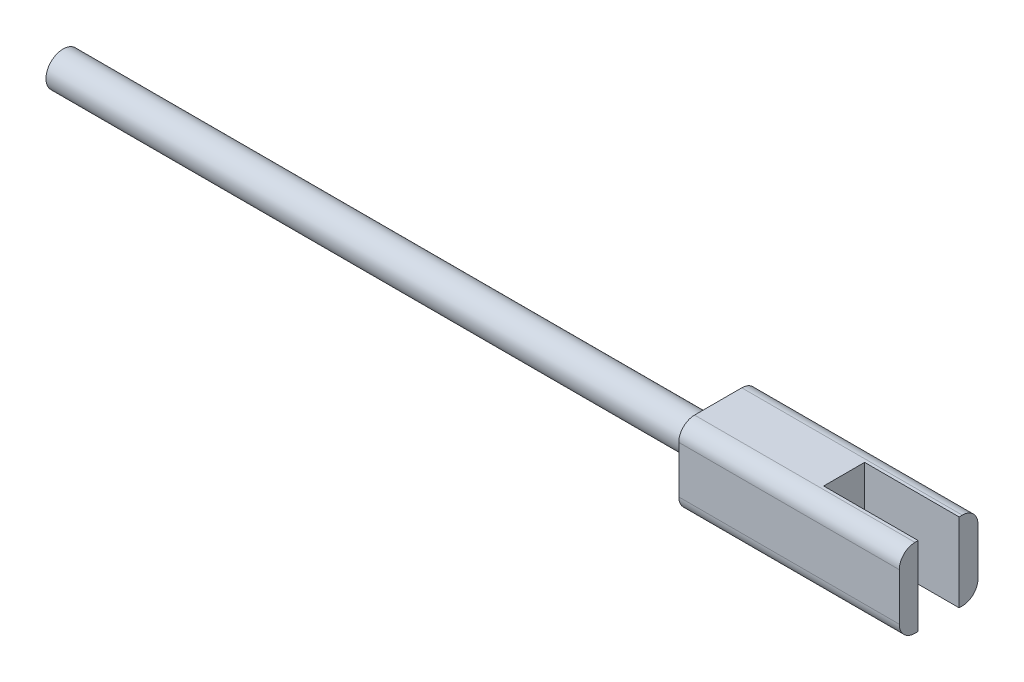
ISO-10303-21;
HEADER;
FILE_DESCRIPTION(('STEP AP214'),'2;1');
FILE_NAME('part.step','',(''),(''),'','','');
FILE_SCHEMA(('AUTOMOTIVE_DESIGN { 1 0 10303 214 1 1 1 1 }'));
ENDSEC;
DATA;
#1=APPLICATION_CONTEXT('core data for automotive mechanical design processes');
#2=APPLICATION_PROTOCOL_DEFINITION('international standard','automotive_design',2000,#1);
#3=PRODUCT_CONTEXT('',#1,'mechanical');
#4=PRODUCT('Part','Part','',(#3));
#5=PRODUCT_RELATED_PRODUCT_CATEGORY('part','',(#4));
#6=PRODUCT_DEFINITION_FORMATION('','',#4);
#7=PRODUCT_DEFINITION_CONTEXT('part definition',#1,'design');
#8=PRODUCT_DEFINITION('design','',#6,#7);
#9=PRODUCT_DEFINITION_SHAPE('','',#8);
#10=(LENGTH_UNIT() NAMED_UNIT(*) SI_UNIT(.MILLI.,.METRE.));
#11=(NAMED_UNIT(*) PLANE_ANGLE_UNIT() SI_UNIT($,.RADIAN.));
#12=(NAMED_UNIT(*) SI_UNIT($,.STERADIAN.) SOLID_ANGLE_UNIT());
#13=UNCERTAINTY_MEASURE_WITH_UNIT(LENGTH_MEASURE(1.E-05),#10,'distance_accuracy_value','');
#14=(GEOMETRIC_REPRESENTATION_CONTEXT(3) GLOBAL_UNCERTAINTY_ASSIGNED_CONTEXT((#13)) GLOBAL_UNIT_ASSIGNED_CONTEXT((#10,
#11,#12)) REPRESENTATION_CONTEXT('',''));
#15=CARTESIAN_POINT('',(0.,0.,0.));
#16=DIRECTION('',(0.,0.,1.));
#17=DIRECTION('',(1.,0.,0.));
#18=AXIS2_PLACEMENT_3D('',#15,#16,#17);
#19=CARTESIAN_POINT('',(55.594,-1.5,1.5));
#20=DIRECTION('',(1.,0.,0.));
#21=DIRECTION('',(0.,0.,-1.));
#22=AXIS2_PLACEMENT_3D('',#19,#20,#21);
#23=PLANE('',#22);
#24=DIRECTION('',(0.,1.,0.));
#25=VECTOR('',#24,1.);
#26=CARTESIAN_POINT('',(55.594,-1.5,-1.3));
#27=LINE('',#26,#25);
#28=CARTESIAN_POINT('',(55.594,-2.5,-1.3));
#29=VERTEX_POINT('',#28);
#30=CARTESIAN_POINT('',(55.594,2.5,-1.3));
#31=VERTEX_POINT('',#30);
#32=EDGE_CURVE('E11',#29,#31,#27,.T.);
#33=ORIENTED_EDGE('',*,*,#32,.F.);
#34=DIRECTION('',(0.,0.,-1.));
#35=VECTOR('',#34,1.);
#36=CARTESIAN_POINT('',(55.594,-2.5,1.5));
#37=LINE('',#36,#35);
#38=CARTESIAN_POINT('',(55.594,-2.5,-1.5));
#39=VERTEX_POINT('',#38);
#40=EDGE_CURVE('E202',#29,#39,#37,.T.);
#41=ORIENTED_EDGE('',*,*,#40,.T.);
#42=CARTESIAN_POINT('',(55.594,-1.5,-1.5));
#43=DIRECTION('',(1.,0.,0.));
#44=DIRECTION('',(0.,0.,-1.));
#45=AXIS2_PLACEMENT_3D('',#42,#43,#44);
#46=CIRCLE('',#45,1.);
#47=CARTESIAN_POINT('',(55.594,-1.5,-2.5));
#48=VERTEX_POINT('',#47);
#49=EDGE_CURVE('E201',#39,#48,#46,.T.);
#50=ORIENTED_EDGE('',*,*,#49,.T.);
#51=DIRECTION('',(0.,1.,0.));
#52=VECTOR('',#51,1.);
#53=CARTESIAN_POINT('',(55.594,-1.5,-2.5));
#54=LINE('',#53,#52);
#55=CARTESIAN_POINT('',(55.594,1.5,-2.5));
#56=VERTEX_POINT('',#55);
#57=EDGE_CURVE('E204',#48,#56,#54,.T.);
#58=ORIENTED_EDGE('',*,*,#57,.T.);
#59=CARTESIAN_POINT('',(55.594,1.5,-1.5));
#60=DIRECTION('',(1.,0.,0.));
#61=DIRECTION('',(0.,0.,-1.));
#62=AXIS2_PLACEMENT_3D('',#59,#60,#61);
#63=CIRCLE('',#62,1.);
#64=CARTESIAN_POINT('',(55.594,2.5,-1.5));
#65=VERTEX_POINT('',#64);
#66=EDGE_CURVE('E129',#56,#65,#63,.T.);
#67=ORIENTED_EDGE('',*,*,#66,.T.);
#68=DIRECTION('',(0.,0.,1.));
#69=VECTOR('',#68,1.);
#70=CARTESIAN_POINT('',(55.594,2.5,-1.5));
#71=LINE('',#70,#69);
#72=EDGE_CURVE('E128',#65,#31,#71,.T.);
#73=ORIENTED_EDGE('',*,*,#72,.T.);
#74=EDGE_LOOP('',(#33,#41,#50,#58,#67,#73));
#75=FACE_BOUND('',#74,.T.);
#76=ADVANCED_FACE('F39',(#75),#23,.T.);
#77=CARTESIAN_POINT('',(43.594,0.,0.));
#78=DIRECTION('',(-1.,0.,0.));
#79=DIRECTION('',(0.,0.,1.));
#80=AXIS2_PLACEMENT_3D('',#77,#78,#79);
#81=CYLINDRICAL_SURFACE('',#80,1.09);
#82=CARTESIAN_POINT('',(0.,0.,0.));
#83=DIRECTION('',(1.,0.,0.));
#84=DIRECTION('',(0.,0.,-1.));
#85=AXIS2_PLACEMENT_3D('',#82,#83,#84);
#86=CIRCLE('',#85,1.09);
#87=CARTESIAN_POINT('',(0.,0.,-1.09));
#88=VERTEX_POINT('',#87);
#89=EDGE_CURVE('E181',#88,#88,#86,.T.);
#90=ORIENTED_EDGE('',*,*,#89,.T.);
#91=EDGE_LOOP('',(#90));
#92=FACE_BOUND('',#91,.T.);
#93=CARTESIAN_POINT('',(41.594,0.,0.));
#94=DIRECTION('',(1.,0.,0.));
#95=DIRECTION('',(0.,0.,-1.));
#96=AXIS2_PLACEMENT_3D('',#93,#94,#95);
#97=CIRCLE('',#96,1.09);
#98=CARTESIAN_POINT('',(41.594,0.,-1.09));
#99=VERTEX_POINT('',#98);
#100=EDGE_CURVE('E184',#99,#99,#97,.T.);
#101=ORIENTED_EDGE('',*,*,#100,.F.);
#102=EDGE_LOOP('',(#101));
#103=FACE_BOUND('',#102,.T.);
#104=ADVANCED_FACE('F41',(#92,#103),#81,.T.);
#105=CARTESIAN_POINT('',(0.,0.,0.));
#106=DIRECTION('',(1.,0.,0.));
#107=DIRECTION('',(0.,0.,-1.));
#108=AXIS2_PLACEMENT_3D('',#105,#106,#107);
#109=PLANE('',#108);
#110=ORIENTED_EDGE('',*,*,#89,.F.);
#111=EDGE_LOOP('',(#110));
#112=FACE_BOUND('',#111,.T.);
#113=ADVANCED_FACE('F264',(#112),#109,.F.);
#114=CARTESIAN_POINT('',(55.594,-1.5,1.5));
#115=DIRECTION('',(-1.,0.,0.));
#116=DIRECTION('',(0.,0.,1.));
#117=AXIS2_PLACEMENT_3D('',#114,#115,#116);
#118=CYLINDRICAL_SURFACE('',#117,1.);
#119=CARTESIAN_POINT('',(41.594,-1.5,1.5));
#120=DIRECTION('',(1.,0.,0.));
#121=DIRECTION('',(0.,0.,-1.));
#122=AXIS2_PLACEMENT_3D('',#119,#120,#121);
#123=CIRCLE('',#122,1.);
#124=CARTESIAN_POINT('',(41.594,-1.5,2.5));
#125=VERTEX_POINT('',#124);
#126=CARTESIAN_POINT('',(41.594,-2.5,1.5));
#127=VERTEX_POINT('',#126);
#128=EDGE_CURVE('E150',#125,#127,#123,.T.);
#129=ORIENTED_EDGE('',*,*,#128,.T.);
#130=DIRECTION('',(-1.,0.,0.));
#131=VECTOR('',#130,1.);
#132=CARTESIAN_POINT('',(55.594,-2.5,1.5));
#133=LINE('',#132,#131);
#134=CARTESIAN_POINT('',(55.594,-2.5,1.5));
#135=VERTEX_POINT('',#134);
#136=EDGE_CURVE('E179',#135,#127,#133,.T.);
#137=ORIENTED_EDGE('',*,*,#136,.F.);
#138=CARTESIAN_POINT('',(55.594,-1.5,1.5));
#139=DIRECTION('',(1.,0.,0.));
#140=DIRECTION('',(0.,0.,-1.));
#141=AXIS2_PLACEMENT_3D('',#138,#139,#140);
#142=CIRCLE('',#141,1.);
#143=CARTESIAN_POINT('',(55.594,-1.5,2.5));
#144=VERTEX_POINT('',#143);
#145=EDGE_CURVE('E166',#144,#135,#142,.T.);
#146=ORIENTED_EDGE('',*,*,#145,.F.);
#147=DIRECTION('',(-1.,0.,0.));
#148=VECTOR('',#147,1.);
#149=CARTESIAN_POINT('',(55.594,-1.5,2.5));
#150=LINE('',#149,#148);
#151=EDGE_CURVE('E145',#144,#125,#150,.T.);
#152=ORIENTED_EDGE('',*,*,#151,.T.);
#153=EDGE_LOOP('',(#129,#137,#146,#152));
#154=FACE_BOUND('',#153,.T.);
#155=ADVANCED_FACE('F262',(#154),#118,.T.);
#156=CARTESIAN_POINT('',(55.594,-2.5,1.5));
#157=DIRECTION('',(0.,1.,0.));
#158=DIRECTION('',(0.,0.,1.));
#159=AXIS2_PLACEMENT_3D('',#156,#157,#158);
#160=PLANE('',#159);
#161=ORIENTED_EDGE('',*,*,#40,.F.);
#162=DIRECTION('',(-1.,0.,0.));
#163=VECTOR('',#162,1.);
#164=CARTESIAN_POINT('',(49.594,-2.5,-1.3));
#165=LINE('',#164,#163);
#166=CARTESIAN_POINT('',(49.594,-2.5,-1.3));
#167=VERTEX_POINT('',#166);
#168=EDGE_CURVE('E197',#29,#167,#165,.T.);
#169=ORIENTED_EDGE('',*,*,#168,.T.);
#170=DIRECTION('',(0.,0.,1.));
#171=VECTOR('',#170,1.);
#172=CARTESIAN_POINT('',(49.594,-2.5,1.3));
#173=LINE('',#172,#171);
#174=CARTESIAN_POINT('',(49.594,-2.5,1.3));
#175=VERTEX_POINT('',#174);
#176=EDGE_CURVE('E196',#167,#175,#173,.T.);
#177=ORIENTED_EDGE('',*,*,#176,.T.);
#178=DIRECTION('',(1.,0.,0.));
#179=VECTOR('',#178,1.);
#180=CARTESIAN_POINT('',(56.594,-2.5,1.3));
#181=LINE('',#180,#179);
#182=CARTESIAN_POINT('',(55.594,-2.5,1.3));
#183=VERTEX_POINT('',#182);
#184=EDGE_CURVE('E189',#175,#183,#181,.T.);
#185=ORIENTED_EDGE('',*,*,#184,.T.);
#186=EDGE_CURVE('E105',#135,#183,#37,.T.);
#187=ORIENTED_EDGE('',*,*,#186,.F.);
#188=ORIENTED_EDGE('',*,*,#136,.T.);
#189=DIRECTION('',(0.,0.,-1.));
#190=VECTOR('',#189,1.);
#191=CARTESIAN_POINT('',(41.594,-2.5,1.5));
#192=LINE('',#191,#190);
#193=CARTESIAN_POINT('',(41.594,-2.5,-1.5));
#194=VERTEX_POINT('',#193);
#195=EDGE_CURVE('E153',#127,#194,#192,.T.);
#196=ORIENTED_EDGE('',*,*,#195,.T.);
#197=DIRECTION('',(-1.,0.,0.));
#198=VECTOR('',#197,1.);
#199=CARTESIAN_POINT('',(55.594,-2.5,-1.5));
#200=LINE('',#199,#198);
#201=EDGE_CURVE('E176',#39,#194,#200,.T.);
#202=ORIENTED_EDGE('',*,*,#201,.F.);
#203=EDGE_LOOP('',(#161,#169,#177,#185,#187,#188,#196,#202));
#204=FACE_BOUND('',#203,.T.);
#205=ADVANCED_FACE('F193',(#204),#160,.F.);
#206=CARTESIAN_POINT('',(55.594,-1.5,-1.5));
#207=DIRECTION('',(-1.,0.,0.));
#208=DIRECTION('',(0.,0.,1.));
#209=AXIS2_PLACEMENT_3D('',#206,#207,#208);
#210=CYLINDRICAL_SURFACE('',#209,1.);
#211=CARTESIAN_POINT('',(41.594,-1.5,-1.5));
#212=DIRECTION('',(1.,0.,0.));
#213=DIRECTION('',(0.,0.,-1.));
#214=AXIS2_PLACEMENT_3D('',#211,#212,#213);
#215=CIRCLE('',#214,1.);
#216=CARTESIAN_POINT('',(41.594,-1.5,-2.5));
#217=VERTEX_POINT('',#216);
#218=EDGE_CURVE('E156',#194,#217,#215,.T.);
#219=ORIENTED_EDGE('',*,*,#218,.T.);
#220=DIRECTION('',(-1.,0.,0.));
#221=VECTOR('',#220,1.);
#222=CARTESIAN_POINT('',(55.594,-1.5,-2.5));
#223=LINE('',#222,#221);
#224=EDGE_CURVE('E173',#48,#217,#223,.T.);
#225=ORIENTED_EDGE('',*,*,#224,.F.);
#226=ORIENTED_EDGE('',*,*,#49,.F.);
#227=ORIENTED_EDGE('',*,*,#201,.T.);
#228=EDGE_LOOP('',(#219,#225,#226,#227));
#229=FACE_BOUND('',#228,.T.);
#230=ADVANCED_FACE('F253',(#229),#210,.T.);
#231=CARTESIAN_POINT('',(55.594,-1.5,-2.5));
#232=DIRECTION('',(0.,0.,1.));
#233=DIRECTION('',(1.,0.,0.));
#234=AXIS2_PLACEMENT_3D('',#231,#232,#233);
#235=PLANE('',#234);
#236=DIRECTION('',(0.,1.,0.));
#237=VECTOR('',#236,1.);
#238=CARTESIAN_POINT('',(41.594,-1.5,-2.5));
#239=LINE('',#238,#237);
#240=CARTESIAN_POINT('',(41.594,1.5,-2.5));
#241=VERTEX_POINT('',#240);
#242=EDGE_CURVE('E158',#217,#241,#239,.T.);
#243=ORIENTED_EDGE('',*,*,#242,.T.);
#244=DIRECTION('',(-1.,0.,0.));
#245=VECTOR('',#244,1.);
#246=CARTESIAN_POINT('',(55.594,1.5,-2.5));
#247=LINE('',#246,#245);
#248=EDGE_CURVE('E170',#56,#241,#247,.T.);
#249=ORIENTED_EDGE('',*,*,#248,.F.);
#250=ORIENTED_EDGE('',*,*,#57,.F.);
#251=ORIENTED_EDGE('',*,*,#224,.T.);
#252=EDGE_LOOP('',(#243,#249,#250,#251));
#253=FACE_BOUND('',#252,.T.);
#254=ADVANCED_FACE('F256',(#253),#235,.F.);
#255=CARTESIAN_POINT('',(55.594,1.5,-1.5));
#256=DIRECTION('',(-1.,0.,0.));
#257=DIRECTION('',(0.,0.,1.));
#258=AXIS2_PLACEMENT_3D('',#255,#256,#257);
#259=CYLINDRICAL_SURFACE('',#258,1.);
#260=CARTESIAN_POINT('',(41.594,1.5,-1.5));
#261=DIRECTION('',(1.,0.,0.));
#262=DIRECTION('',(0.,0.,-1.));
#263=AXIS2_PLACEMENT_3D('',#260,#261,#262);
#264=CIRCLE('',#263,1.);
#265=CARTESIAN_POINT('',(41.594,2.5,-1.5));
#266=VERTEX_POINT('',#265);
#267=EDGE_CURVE('E160',#241,#266,#264,.T.);
#268=ORIENTED_EDGE('',*,*,#267,.T.);
#269=DIRECTION('',(-1.,0.,0.));
#270=VECTOR('',#269,1.);
#271=CARTESIAN_POINT('',(55.594,2.5,-1.5));
#272=LINE('',#271,#270);
#273=EDGE_CURVE('E140',#65,#266,#272,.T.);
#274=ORIENTED_EDGE('',*,*,#273,.F.);
#275=ORIENTED_EDGE('',*,*,#66,.F.);
#276=ORIENTED_EDGE('',*,*,#248,.T.);
#277=EDGE_LOOP('',(#268,#274,#275,#276));
#278=FACE_BOUND('',#277,.T.);
#279=ADVANCED_FACE('F218',(#278),#259,.T.);
#280=CARTESIAN_POINT('',(55.594,2.5,-1.5));
#281=DIRECTION('',(0.,-1.,0.));
#282=DIRECTION('',(0.,0.,-1.));
#283=AXIS2_PLACEMENT_3D('',#280,#281,#282);
#284=PLANE('',#283);
#285=DIRECTION('',(0.,0.,1.));
#286=VECTOR('',#285,1.);
#287=CARTESIAN_POINT('',(49.594,2.5,1.3));
#288=LINE('',#287,#286);
#289=CARTESIAN_POINT('',(49.594,2.5,-1.3));
#290=VERTEX_POINT('',#289);
#291=CARTESIAN_POINT('',(49.594,2.5,1.3));
#292=VERTEX_POINT('',#291);
#293=EDGE_CURVE('E225',#290,#292,#288,.T.);
#294=ORIENTED_EDGE('',*,*,#293,.F.);
#295=DIRECTION('',(-1.,0.,0.));
#296=VECTOR('',#295,1.);
#297=CARTESIAN_POINT('',(49.594,2.5,-1.3));
#298=LINE('',#297,#296);
#299=EDGE_CURVE('E222',#31,#290,#298,.T.);
#300=ORIENTED_EDGE('',*,*,#299,.F.);
#301=ORIENTED_EDGE('',*,*,#72,.F.);
#302=ORIENTED_EDGE('',*,*,#273,.T.);
#303=DIRECTION('',(0.,0.,1.));
#304=VECTOR('',#303,1.);
#305=CARTESIAN_POINT('',(41.594,2.5,-1.5));
#306=LINE('',#305,#304);
#307=CARTESIAN_POINT('',(41.594,2.5,1.5));
#308=VERTEX_POINT('',#307);
#309=EDGE_CURVE('E137',#266,#308,#306,.T.);
#310=ORIENTED_EDGE('',*,*,#309,.T.);
#311=DIRECTION('',(-1.,0.,0.));
#312=VECTOR('',#311,1.);
#313=CARTESIAN_POINT('',(55.594,2.5,1.5));
#314=LINE('',#313,#312);
#315=CARTESIAN_POINT('',(55.594,2.5,1.5));
#316=VERTEX_POINT('',#315);
#317=EDGE_CURVE('E132',#316,#308,#314,.T.);
#318=ORIENTED_EDGE('',*,*,#317,.F.);
#319=CARTESIAN_POINT('',(55.594,2.5,1.3));
#320=VERTEX_POINT('',#319);
#321=EDGE_CURVE('E121',#320,#316,#71,.T.);
#322=ORIENTED_EDGE('',*,*,#321,.F.);
#323=DIRECTION('',(1.,0.,0.));
#324=VECTOR('',#323,1.);
#325=CARTESIAN_POINT('',(56.594,2.5,1.3));
#326=LINE('',#325,#324);
#327=EDGE_CURVE('E54',#292,#320,#326,.T.);
#328=ORIENTED_EDGE('',*,*,#327,.F.);
#329=EDGE_LOOP('',(#294,#300,#301,#302,#310,#318,#322,#328));
#330=FACE_BOUND('',#329,.T.);
#331=ADVANCED_FACE('F134',(#330),#284,.F.);
#332=CARTESIAN_POINT('',(55.594,1.5,1.5));
#333=DIRECTION('',(-1.,0.,0.));
#334=DIRECTION('',(0.,0.,1.));
#335=AXIS2_PLACEMENT_3D('',#332,#333,#334);
#336=CYLINDRICAL_SURFACE('',#335,1.);
#337=CARTESIAN_POINT('',(41.594,1.5,1.5));
#338=DIRECTION('',(1.,0.,0.));
#339=DIRECTION('',(0.,0.,-1.));
#340=AXIS2_PLACEMENT_3D('',#337,#338,#339);
#341=CIRCLE('',#340,1.);
#342=CARTESIAN_POINT('',(41.594,1.5,2.5));
#343=VERTEX_POINT('',#342);
#344=EDGE_CURVE('E163',#308,#343,#341,.T.);
#345=ORIENTED_EDGE('',*,*,#344,.T.);
#346=DIRECTION('',(-1.,0.,0.));
#347=VECTOR('',#346,1.);
#348=CARTESIAN_POINT('',(55.594,1.5,2.5));
#349=LINE('',#348,#347);
#350=CARTESIAN_POINT('',(55.594,1.5,2.5));
#351=VERTEX_POINT('',#350);
#352=EDGE_CURVE('E141',#351,#343,#349,.T.);
#353=ORIENTED_EDGE('',*,*,#352,.F.);
#354=CARTESIAN_POINT('',(55.594,1.5,1.5));
#355=DIRECTION('',(1.,0.,0.));
#356=DIRECTION('',(0.,0.,-1.));
#357=AXIS2_PLACEMENT_3D('',#354,#355,#356);
#358=CIRCLE('',#357,1.);
#359=EDGE_CURVE('E125',#316,#351,#358,.T.);
#360=ORIENTED_EDGE('',*,*,#359,.F.);
#361=ORIENTED_EDGE('',*,*,#317,.T.);
#362=EDGE_LOOP('',(#345,#353,#360,#361));
#363=FACE_BOUND('',#362,.T.);
#364=ADVANCED_FACE('F143',(#363),#336,.T.);
#365=CARTESIAN_POINT('',(55.594,1.5,2.5));
#366=DIRECTION('',(0.,0.,-1.));
#367=DIRECTION('',(-1.,0.,0.));
#368=AXIS2_PLACEMENT_3D('',#365,#366,#367);
#369=PLANE('',#368);
#370=DIRECTION('',(0.,-1.,0.));
#371=VECTOR('',#370,1.);
#372=CARTESIAN_POINT('',(41.594,1.5,2.5));
#373=LINE('',#372,#371);
#374=EDGE_CURVE('E96',#343,#125,#373,.T.);
#375=ORIENTED_EDGE('',*,*,#374,.T.);
#376=ORIENTED_EDGE('',*,*,#151,.F.);
#377=DIRECTION('',(0.,-1.,0.));
#378=VECTOR('',#377,1.);
#379=CARTESIAN_POINT('',(55.594,1.5,2.5));
#380=LINE('',#379,#378);
#381=EDGE_CURVE('E63',#351,#144,#380,.T.);
#382=ORIENTED_EDGE('',*,*,#381,.F.);
#383=ORIENTED_EDGE('',*,*,#352,.T.);
#384=EDGE_LOOP('',(#375,#376,#382,#383));
#385=FACE_BOUND('',#384,.T.);
#386=ADVANCED_FACE('F260',(#385),#369,.F.);
#387=DIRECTION('',(0.,-1.,0.));
#388=VECTOR('',#387,1.);
#389=CARTESIAN_POINT('',(55.594,-1.5,1.3));
#390=LINE('',#389,#388);
#391=EDGE_CURVE('E47',#320,#183,#390,.T.);
#392=ORIENTED_EDGE('',*,*,#391,.F.);
#393=ORIENTED_EDGE('',*,*,#321,.T.);
#394=ORIENTED_EDGE('',*,*,#359,.T.);
#395=ORIENTED_EDGE('',*,*,#381,.T.);
#396=ORIENTED_EDGE('',*,*,#145,.T.);
#397=ORIENTED_EDGE('',*,*,#186,.T.);
#398=EDGE_LOOP('',(#392,#393,#394,#395,#396,#397));
#399=FACE_BOUND('',#398,.T.);
#400=ADVANCED_FACE('F123',(#399),#23,.T.);
#401=CARTESIAN_POINT('',(41.594,-1.5,1.5));
#402=DIRECTION('',(1.,0.,0.));
#403=DIRECTION('',(0.,0.,-1.));
#404=AXIS2_PLACEMENT_3D('',#401,#402,#403);
#405=PLANE('',#404);
#406=ORIENTED_EDGE('',*,*,#100,.T.);
#407=EDGE_LOOP('',(#406));
#408=FACE_BOUND('',#407,.T.);
#409=ORIENTED_EDGE('',*,*,#128,.F.);
#410=ORIENTED_EDGE('',*,*,#374,.F.);
#411=ORIENTED_EDGE('',*,*,#344,.F.);
#412=ORIENTED_EDGE('',*,*,#309,.F.);
#413=ORIENTED_EDGE('',*,*,#267,.F.);
#414=ORIENTED_EDGE('',*,*,#242,.F.);
#415=ORIENTED_EDGE('',*,*,#218,.F.);
#416=ORIENTED_EDGE('',*,*,#195,.F.);
#417=EDGE_LOOP('',(#409,#410,#411,#412,#413,#414,#415,#416));
#418=FACE_BOUND('',#417,.T.);
#419=ADVANCED_FACE('F259',(#408,#418),#405,.F.);
#420=CARTESIAN_POINT('',(49.594,-2.5,1.3));
#421=DIRECTION('',(-1.,0.,0.));
#422=DIRECTION('',(0.,0.,1.));
#423=AXIS2_PLACEMENT_3D('',#420,#421,#422);
#424=PLANE('',#423);
#425=DIRECTION('',(0.,1.,0.));
#426=VECTOR('',#425,1.);
#427=CARTESIAN_POINT('',(49.594,-2.5,1.3));
#428=LINE('',#427,#426);
#429=EDGE_CURVE('E237',#175,#292,#428,.T.);
#430=ORIENTED_EDGE('',*,*,#429,.F.);
#431=ORIENTED_EDGE('',*,*,#176,.F.);
#432=DIRECTION('',(0.,1.,0.));
#433=VECTOR('',#432,1.);
#434=CARTESIAN_POINT('',(49.594,-2.5,-1.3));
#435=LINE('',#434,#433);
#436=EDGE_CURVE('E154',#167,#290,#435,.T.);
#437=ORIENTED_EDGE('',*,*,#436,.T.);
#438=ORIENTED_EDGE('',*,*,#293,.T.);
#439=EDGE_LOOP('',(#430,#431,#437,#438));
#440=FACE_BOUND('',#439,.T.);
#441=ADVANCED_FACE('F242',(#440),#424,.F.);
#442=CARTESIAN_POINT('',(49.594,-2.5,-1.3));
#443=DIRECTION('',(0.,0.,-1.));
#444=DIRECTION('',(-1.,0.,0.));
#445=AXIS2_PLACEMENT_3D('',#442,#443,#444);
#446=PLANE('',#445);
#447=ORIENTED_EDGE('',*,*,#32,.T.);
#448=ORIENTED_EDGE('',*,*,#299,.T.);
#449=ORIENTED_EDGE('',*,*,#436,.F.);
#450=ORIENTED_EDGE('',*,*,#168,.F.);
#451=EDGE_LOOP('',(#447,#448,#449,#450));
#452=FACE_BOUND('',#451,.T.);
#453=ADVANCED_FACE('F245',(#452),#446,.F.);
#454=CARTESIAN_POINT('',(56.594,-2.5,1.3));
#455=DIRECTION('',(0.,0.,1.));
#456=DIRECTION('',(1.,0.,0.));
#457=AXIS2_PLACEMENT_3D('',#454,#455,#456);
#458=PLANE('',#457);
#459=ORIENTED_EDGE('',*,*,#391,.T.);
#460=ORIENTED_EDGE('',*,*,#184,.F.);
#461=ORIENTED_EDGE('',*,*,#429,.T.);
#462=ORIENTED_EDGE('',*,*,#327,.T.);
#463=EDGE_LOOP('',(#459,#460,#461,#462));
#464=FACE_BOUND('',#463,.T.);
#465=ADVANCED_FACE('F187',(#464),#458,.F.);
#466=CLOSED_SHELL('',(#76,#104,#113,#155,#205,#230,#254,#279,#331,#364,#386,#400,#419,#441,#453,#465));
#467=MANIFOLD_SOLID_BREP('B2',#466);
#468=ADVANCED_BREP_SHAPE_REPRESENTATION('',(#18,#467),#14);
#469=SHAPE_DEFINITION_REPRESENTATION(#9,#468);
ENDSEC;
END-ISO-10303-21;
